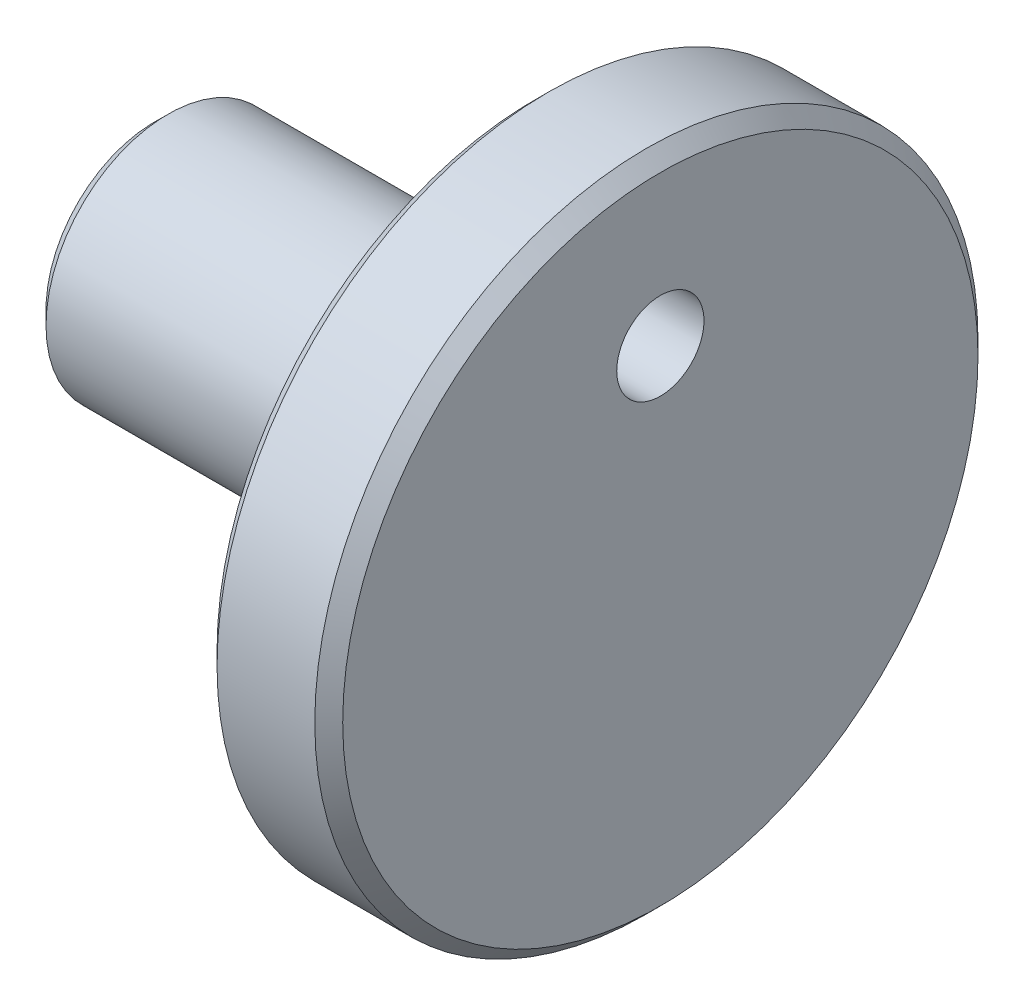
ISO-10303-21;
HEADER;
FILE_DESCRIPTION(('STEP AP214'),'2;1');
FILE_NAME('part.step','',(''),(''),'','','');
FILE_SCHEMA(('AUTOMOTIVE_DESIGN { 1 0 10303 214 1 1 1 1 }'));
ENDSEC;
DATA;
#1=APPLICATION_CONTEXT('core data for automotive mechanical design processes');
#2=APPLICATION_PROTOCOL_DEFINITION('international standard','automotive_design',2000,#1);
#3=PRODUCT_CONTEXT('',#1,'mechanical');
#4=PRODUCT('Part','Part','',(#3));
#5=PRODUCT_RELATED_PRODUCT_CATEGORY('part','',(#4));
#6=PRODUCT_DEFINITION_FORMATION('','',#4);
#7=PRODUCT_DEFINITION_CONTEXT('part definition',#1,'design');
#8=PRODUCT_DEFINITION('design','',#6,#7);
#9=PRODUCT_DEFINITION_SHAPE('','',#8);
#10=(LENGTH_UNIT() NAMED_UNIT(*) SI_UNIT(.MILLI.,.METRE.));
#11=(NAMED_UNIT(*) PLANE_ANGLE_UNIT() SI_UNIT($,.RADIAN.));
#12=(NAMED_UNIT(*) SI_UNIT($,.STERADIAN.) SOLID_ANGLE_UNIT());
#13=UNCERTAINTY_MEASURE_WITH_UNIT(LENGTH_MEASURE(1.E-05),#10,'distance_accuracy_value','');
#14=(GEOMETRIC_REPRESENTATION_CONTEXT(3) GLOBAL_UNCERTAINTY_ASSIGNED_CONTEXT((#13)) GLOBAL_UNIT_ASSIGNED_CONTEXT((#10,
#11,#12)) REPRESENTATION_CONTEXT('',''));
#15=CARTESIAN_POINT('',(0.,0.,0.));
#16=DIRECTION('',(0.,0.,1.));
#17=DIRECTION('',(1.,0.,0.));
#18=AXIS2_PLACEMENT_3D('',#15,#16,#17);
#19=CARTESIAN_POINT('',(0.,0.,0.));
#20=DIRECTION('',(-1.,0.,0.));
#21=DIRECTION('',(0.,0.,1.));
#22=AXIS2_PLACEMENT_3D('',#19,#20,#21);
#23=PLANE('',#22);
#24=CARTESIAN_POINT('',(0.,0.,0.));
#25=DIRECTION('',(-1.,0.,0.));
#26=DIRECTION('',(0.,0.,1.));
#27=AXIS2_PLACEMENT_3D('',#24,#25,#26);
#28=CIRCLE('',#27,9.1);
#29=CARTESIAN_POINT('',(0.,0.,9.1));
#30=VERTEX_POINT('',#29);
#31=EDGE_CURVE('E42',#30,#30,#28,.F.);
#32=ORIENTED_EDGE('',*,*,#31,.T.);
#33=EDGE_LOOP('',(#32));
#34=FACE_BOUND('',#33,.T.);
#35=CARTESIAN_POINT('',(0.,4.8,0.));
#36=DIRECTION('',(-1.,0.,0.));
#37=DIRECTION('',(0.,0.,1.));
#38=AXIS2_PLACEMENT_3D('',#35,#36,#37);
#39=CIRCLE('',#38,1.25);
#40=CARTESIAN_POINT('',(0.,4.8,1.25));
#41=VERTEX_POINT('',#40);
#42=EDGE_CURVE('E64',#41,#41,#39,.T.);
#43=ORIENTED_EDGE('',*,*,#42,.T.);
#44=EDGE_LOOP('',(#43));
#45=FACE_BOUND('',#44,.T.);
#46=ADVANCED_FACE('F34',(#34,#45),#23,.F.);
#47=CARTESIAN_POINT('',(-14.5,0.,0.));
#48=DIRECTION('',(-1.,0.,0.));
#49=DIRECTION('',(0.,0.,1.));
#50=AXIS2_PLACEMENT_3D('',#47,#48,#49);
#51=CYLINDRICAL_SURFACE('',#50,9.5);
#52=CARTESIAN_POINT('',(-0.399999999999998,0.,0.));
#53=DIRECTION('',(-1.,0.,0.));
#54=DIRECTION('',(0.,0.,1.));
#55=AXIS2_PLACEMENT_3D('',#52,#53,#54);
#56=CIRCLE('',#55,9.5);
#57=CARTESIAN_POINT('',(-0.399999999999998,0.,9.5));
#58=VERTEX_POINT('',#57);
#59=EDGE_CURVE('E46',#58,#58,#56,.T.);
#60=ORIENTED_EDGE('',*,*,#59,.T.);
#61=EDGE_LOOP('',(#60));
#62=FACE_BOUND('',#61,.T.);
#63=CARTESIAN_POINT('',(-3.2,0.,0.));
#64=DIRECTION('',(1.,0.,0.));
#65=DIRECTION('',(0.,0.,-1.));
#66=AXIS2_PLACEMENT_3D('',#63,#64,#65);
#67=CIRCLE('',#66,9.5);
#68=CARTESIAN_POINT('',(-3.2,0.,-9.5));
#69=VERTEX_POINT('',#68);
#70=EDGE_CURVE('E50',#69,#69,#67,.T.);
#71=ORIENTED_EDGE('',*,*,#70,.T.);
#72=EDGE_LOOP('',(#71));
#73=FACE_BOUND('',#72,.T.);
#74=ADVANCED_FACE('F84',(#62,#73),#51,.T.);
#75=CARTESIAN_POINT('',(-3.6,9.5,0.));
#76=DIRECTION('',(1.,0.,0.));
#77=DIRECTION('',(0.,0.,-1.));
#78=AXIS2_PLACEMENT_3D('',#75,#76,#77);
#79=PLANE('',#78);
#80=CARTESIAN_POINT('',(-3.6,0.,0.));
#81=DIRECTION('',(1.,0.,0.));
#82=DIRECTION('',(0.,0.,-1.));
#83=AXIS2_PLACEMENT_3D('',#80,#81,#82);
#84=CIRCLE('',#83,9.1);
#85=CARTESIAN_POINT('',(-3.6,0.,-9.1));
#86=VERTEX_POINT('',#85);
#87=EDGE_CURVE('E10',#86,#86,#84,.F.);
#88=ORIENTED_EDGE('',*,*,#87,.T.);
#89=EDGE_LOOP('',(#88));
#90=FACE_BOUND('',#89,.T.);
#91=CARTESIAN_POINT('',(-3.6,4.8,0.));
#92=DIRECTION('',(-1.,0.,0.));
#93=DIRECTION('',(0.,0.,1.));
#94=AXIS2_PLACEMENT_3D('',#91,#92,#93);
#95=CIRCLE('',#94,1.25);
#96=CARTESIAN_POINT('',(-3.6,4.8,1.25));
#97=VERTEX_POINT('',#96);
#98=EDGE_CURVE('E65',#97,#97,#95,.T.);
#99=ORIENTED_EDGE('',*,*,#98,.F.);
#100=EDGE_LOOP('',(#99));
#101=FACE_BOUND('',#100,.T.);
#102=CARTESIAN_POINT('',(-3.6,0.,0.));
#103=DIRECTION('',(-1.,0.,0.));
#104=DIRECTION('',(0.,0.,1.));
#105=AXIS2_PLACEMENT_3D('',#102,#103,#104);
#106=CIRCLE('',#105,3.5);
#107=CARTESIAN_POINT('',(-3.6,0.,3.5));
#108=VERTEX_POINT('',#107);
#109=EDGE_CURVE('E61',#108,#108,#106,.T.);
#110=ORIENTED_EDGE('',*,*,#109,.F.);
#111=EDGE_LOOP('',(#110));
#112=FACE_BOUND('',#111,.T.);
#113=ADVANCED_FACE('F80',(#90,#101,#112),#79,.F.);
#114=CARTESIAN_POINT('',(-14.5,0.,0.));
#115=DIRECTION('',(-1.,0.,0.));
#116=DIRECTION('',(0.,0.,1.));
#117=AXIS2_PLACEMENT_3D('',#114,#115,#116);
#118=CYLINDRICAL_SURFACE('',#117,3.5);
#119=CARTESIAN_POINT('',(-14.1,0.,0.));
#120=DIRECTION('',(1.,0.,0.));
#121=DIRECTION('',(0.,0.,-1.));
#122=AXIS2_PLACEMENT_3D('',#119,#120,#121);
#123=CIRCLE('',#122,3.5);
#124=CARTESIAN_POINT('',(-14.1,0.,-3.5));
#125=VERTEX_POINT('',#124);
#126=EDGE_CURVE('E55',#125,#125,#123,.T.);
#127=ORIENTED_EDGE('',*,*,#126,.T.);
#128=EDGE_LOOP('',(#127));
#129=FACE_BOUND('',#128,.T.);
#130=ORIENTED_EDGE('',*,*,#109,.T.);
#131=EDGE_LOOP('',(#130));
#132=FACE_BOUND('',#131,.T.);
#133=ADVANCED_FACE('F83',(#129,#132),#118,.T.);
#134=CARTESIAN_POINT('',(-14.5,3.5,0.));
#135=DIRECTION('',(1.,0.,0.));
#136=DIRECTION('',(0.,0.,-1.));
#137=AXIS2_PLACEMENT_3D('',#134,#135,#136);
#138=PLANE('',#137);
#139=CARTESIAN_POINT('',(-14.5,0.,0.));
#140=DIRECTION('',(1.,0.,0.));
#141=DIRECTION('',(0.,0.,-1.));
#142=AXIS2_PLACEMENT_3D('',#139,#140,#141);
#143=CIRCLE('',#142,3.1);
#144=CARTESIAN_POINT('',(-14.5,0.,-3.1));
#145=VERTEX_POINT('',#144);
#146=EDGE_CURVE('E58',#145,#145,#143,.F.);
#147=ORIENTED_EDGE('',*,*,#146,.T.);
#148=EDGE_LOOP('',(#147));
#149=FACE_BOUND('',#148,.T.);
#150=ADVANCED_FACE('F76',(#149),#138,.F.);
#151=CARTESIAN_POINT('',(0.,4.8,0.));
#152=DIRECTION('',(-1.,0.,0.));
#153=DIRECTION('',(0.,0.,1.));
#154=AXIS2_PLACEMENT_3D('',#151,#152,#153);
#155=CYLINDRICAL_SURFACE('',#154,1.25);
#156=CARTESIAN_POINT('',(0.,4.8,1.25));
#157=CARTESIAN_POINT('',(-0.0374999999999999,4.8,1.25));
#158=CARTESIAN_POINT('',(-0.075,4.8,1.25));
#159=CARTESIAN_POINT('',(-0.15,4.8,1.25));
#160=CARTESIAN_POINT('',(-0.1875,4.8,1.25));
#161=CARTESIAN_POINT('',(-0.2625,4.8,1.25));
#162=CARTESIAN_POINT('',(-0.3,4.8,1.25));
#163=CARTESIAN_POINT('',(-0.375,4.8,1.25));
#164=CARTESIAN_POINT('',(-0.4125,4.8,1.25));
#165=CARTESIAN_POINT('',(-0.4875,4.8,1.25));
#166=CARTESIAN_POINT('',(-0.525,4.8,1.25));
#167=CARTESIAN_POINT('',(-0.6,4.8,1.25));
#168=CARTESIAN_POINT('',(-0.6375,4.8,1.25));
#169=CARTESIAN_POINT('',(-0.7125,4.8,1.25));
#170=CARTESIAN_POINT('',(-0.75,4.8,1.25));
#171=CARTESIAN_POINT('',(-0.825,4.8,1.25));
#172=CARTESIAN_POINT('',(-0.8625,4.8,1.25));
#173=CARTESIAN_POINT('',(-0.9375,4.8,1.25));
#174=CARTESIAN_POINT('',(-0.975,4.8,1.25));
#175=CARTESIAN_POINT('',(-1.05,4.8,1.25));
#176=CARTESIAN_POINT('',(-1.0875,4.8,1.25));
#177=CARTESIAN_POINT('',(-1.1625,4.8,1.25));
#178=CARTESIAN_POINT('',(-1.2,4.8,1.25));
#179=CARTESIAN_POINT('',(-1.275,4.8,1.25));
#180=CARTESIAN_POINT('',(-1.3125,4.8,1.25));
#181=CARTESIAN_POINT('',(-1.3875,4.8,1.25));
#182=CARTESIAN_POINT('',(-1.425,4.8,1.25));
#183=CARTESIAN_POINT('',(-1.5,4.8,1.25));
#184=CARTESIAN_POINT('',(-1.5375,4.8,1.25));
#185=CARTESIAN_POINT('',(-1.6125,4.8,1.25));
#186=CARTESIAN_POINT('',(-1.65,4.8,1.25));
#187=CARTESIAN_POINT('',(-1.725,4.8,1.25));
#188=CARTESIAN_POINT('',(-1.7625,4.8,1.25));
#189=CARTESIAN_POINT('',(-1.8375,4.8,1.25));
#190=CARTESIAN_POINT('',(-1.875,4.8,1.25));
#191=CARTESIAN_POINT('',(-1.95,4.8,1.25));
#192=CARTESIAN_POINT('',(-1.9875,4.8,1.25));
#193=CARTESIAN_POINT('',(-2.0625,4.8,1.25));
#194=CARTESIAN_POINT('',(-2.1,4.8,1.25));
#195=CARTESIAN_POINT('',(-2.175,4.8,1.25));
#196=CARTESIAN_POINT('',(-2.2125,4.8,1.25));
#197=CARTESIAN_POINT('',(-2.2875,4.8,1.25));
#198=CARTESIAN_POINT('',(-2.325,4.8,1.25));
#199=CARTESIAN_POINT('',(-2.4,4.8,1.25));
#200=CARTESIAN_POINT('',(-2.4375,4.8,1.25));
#201=CARTESIAN_POINT('',(-2.5125,4.8,1.25));
#202=CARTESIAN_POINT('',(-2.55,4.8,1.25));
#203=CARTESIAN_POINT('',(-2.625,4.8,1.25));
#204=CARTESIAN_POINT('',(-2.6625,4.8,1.25));
#205=CARTESIAN_POINT('',(-2.7375,4.8,1.25));
#206=CARTESIAN_POINT('',(-2.775,4.8,1.25));
#207=CARTESIAN_POINT('',(-2.85,4.8,1.25));
#208=CARTESIAN_POINT('',(-2.8875,4.8,1.25));
#209=CARTESIAN_POINT('',(-2.9625,4.8,1.25));
#210=CARTESIAN_POINT('',(-3.,4.8,1.25));
#211=CARTESIAN_POINT('',(-3.075,4.8,1.25));
#212=CARTESIAN_POINT('',(-3.1125,4.8,1.25));
#213=CARTESIAN_POINT('',(-3.1875,4.8,1.25));
#214=CARTESIAN_POINT('',(-3.225,4.8,1.25));
#215=CARTESIAN_POINT('',(-3.3,4.8,1.25));
#216=CARTESIAN_POINT('',(-3.3375,4.8,1.25));
#217=CARTESIAN_POINT('',(-3.4125,4.8,1.25));
#218=CARTESIAN_POINT('',(-3.45,4.8,1.25));
#219=CARTESIAN_POINT('',(-3.525,4.8,1.25));
#220=CARTESIAN_POINT('',(-3.5625,4.8,1.25));
#221=CARTESIAN_POINT('',(-3.6,4.8,1.25));
#222=B_SPLINE_CURVE_WITH_KNOTS('',3,(#156,#157,#158,#159,#160,#161,#162,#163,#164,#165,#166,
#167,#168,#169,#170,#171,#172,#173,#174,#175,#176,#177,#178,#179,#180,#181,#182,#183,#184,#185,
#186,#187,#188,#189,#190,#191,#192,#193,#194,#195,#196,#197,#198,#199,#200,#201,#202,#203,#204,
#205,#206,#207,#208,#209,#210,#211,#212,#213,#214,#215,#216,#217,#218,#219,#220,#221),
.UNSPECIFIED.,.F.,.F.,(4,2,2,2,2,2,2,2,2,2,2,2,2,2,2,2,2,2,2,2,2,2,2,2,2,2,2,2,2,2,2,2,4),(0.,
0.1125,0.225,0.3375,0.45,0.5625,0.675,0.7875,0.9,1.0125,1.125,1.2375,1.35,1.4625,1.575,1.6875,
1.8,1.9125,2.025,2.1375,2.25,2.3625,2.475,2.5875,2.7,2.8125,2.925,3.0375,3.15,3.2625,3.375,
3.4875,3.6),.UNSPECIFIED.);
#223=EDGE_CURVE('BSEAM72',#41,#97,#222,.T.);
#224=ORIENTED_EDGE('',*,*,#42,.F.);
#225=ORIENTED_EDGE('',*,*,#98,.T.);
#226=ORIENTED_EDGE('',*,*,#223,.T.);
#227=ORIENTED_EDGE('',*,*,#223,.F.);
#228=EDGE_LOOP('',(#224,#226,#225,#227));
#229=FACE_BOUND('',#228,.T.);
#230=ADVANCED_FACE('F72',(#229),#155,.F.);
#231=CARTESIAN_POINT('',(-14.5,0.,0.));
#232=DIRECTION('',(1.,0.,0.));
#233=DIRECTION('',(0.,0.,-1.));
#234=AXIS2_PLACEMENT_3D('',#231,#232,#233);
#235=CONICAL_SURFACE('',#234,3.1,0.785398163397446);
#236=ORIENTED_EDGE('',*,*,#126,.F.);
#237=EDGE_LOOP('',(#236));
#238=FACE_BOUND('',#237,.T.);
#239=ORIENTED_EDGE('',*,*,#146,.F.);
#240=EDGE_LOOP('',(#239));
#241=FACE_BOUND('',#240,.T.);
#242=ADVANCED_FACE('F75',(#238,#241),#235,.T.);
#243=CARTESIAN_POINT('',(-0.399999999999998,0.,0.));
#244=DIRECTION('',(-1.,0.,0.));
#245=DIRECTION('',(0.,0.,1.));
#246=AXIS2_PLACEMENT_3D('',#243,#244,#245);
#247=CONICAL_SURFACE('',#246,9.5,0.785398163397453);
#248=ORIENTED_EDGE('',*,*,#31,.F.);
#249=EDGE_LOOP('',(#248));
#250=FACE_BOUND('',#249,.T.);
#251=ORIENTED_EDGE('',*,*,#59,.F.);
#252=EDGE_LOOP('',(#251));
#253=FACE_BOUND('',#252,.T.);
#254=ADVANCED_FACE('F109',(#250,#253),#247,.T.);
#255=CARTESIAN_POINT('',(-3.6,0.,0.));
#256=DIRECTION('',(1.,0.,0.));
#257=DIRECTION('',(0.,0.,-1.));
#258=AXIS2_PLACEMENT_3D('',#255,#256,#257);
#259=CONICAL_SURFACE('',#258,9.1,0.785398163397446);
#260=ORIENTED_EDGE('',*,*,#70,.F.);
#261=EDGE_LOOP('',(#260));
#262=FACE_BOUND('',#261,.T.);
#263=ORIENTED_EDGE('',*,*,#87,.F.);
#264=EDGE_LOOP('',(#263));
#265=FACE_BOUND('',#264,.T.);
#266=ADVANCED_FACE('F37',(#262,#265),#259,.T.);
#267=CLOSED_SHELL('',(#46,#74,#113,#133,#150,#230,#242,#254,#266));
#268=MANIFOLD_SOLID_BREP('B2',#267);
#269=ADVANCED_BREP_SHAPE_REPRESENTATION('',(#18,#268),#14);
#270=SHAPE_DEFINITION_REPRESENTATION(#9,#269);
ENDSEC;
END-ISO-10303-21;
